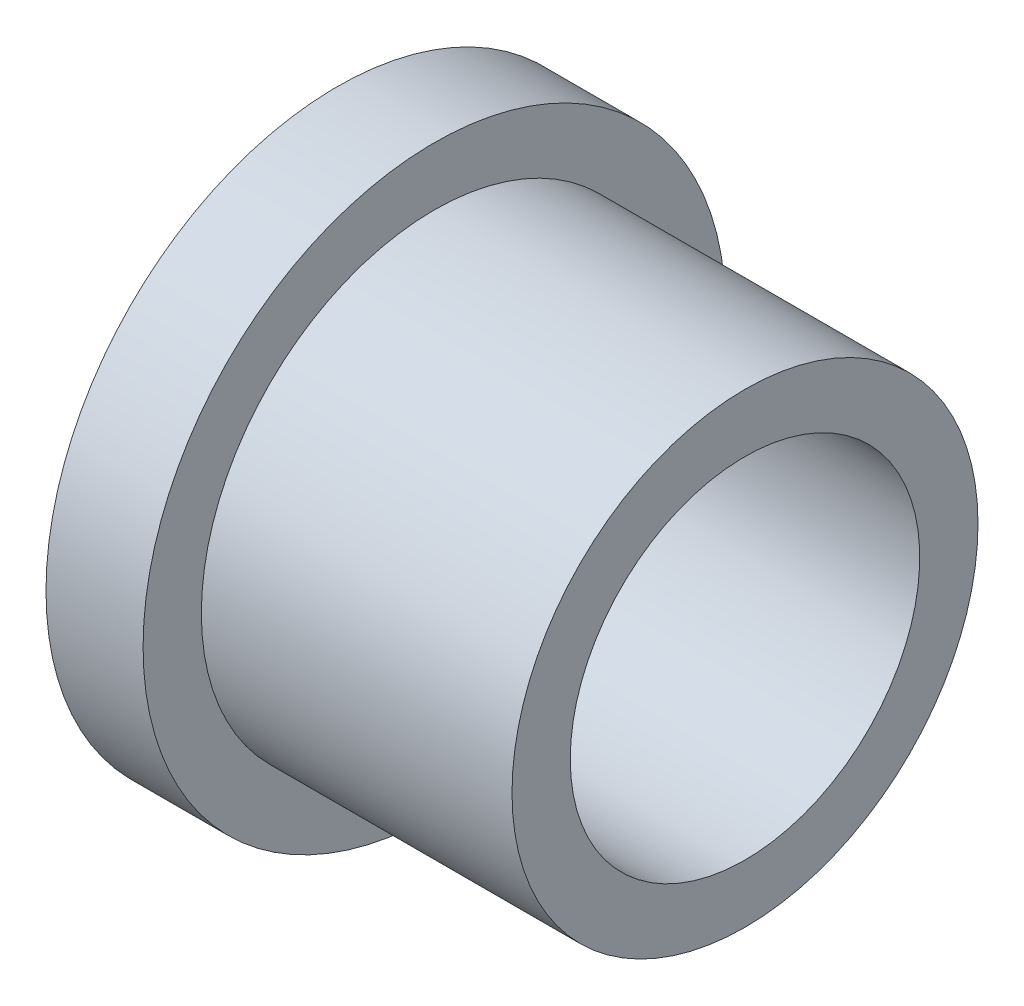
ISO-10303-21;
HEADER;
FILE_DESCRIPTION(('STEP AP214'),'2;1');
FILE_NAME('part.step','',(''),(''),'','','');
FILE_SCHEMA(('AUTOMOTIVE_DESIGN { 1 0 10303 214 1 1 1 1 }'));
ENDSEC;
DATA;
#1=APPLICATION_CONTEXT('core data for automotive mechanical design processes');
#2=APPLICATION_PROTOCOL_DEFINITION('international standard','automotive_design',2000,#1);
#3=PRODUCT_CONTEXT('',#1,'mechanical');
#4=PRODUCT('Part','Part','',(#3));
#5=PRODUCT_RELATED_PRODUCT_CATEGORY('part','',(#4));
#6=PRODUCT_DEFINITION_FORMATION('','',#4);
#7=PRODUCT_DEFINITION_CONTEXT('part definition',#1,'design');
#8=PRODUCT_DEFINITION('design','',#6,#7);
#9=PRODUCT_DEFINITION_SHAPE('','',#8);
#10=(LENGTH_UNIT() NAMED_UNIT(*) SI_UNIT(.MILLI.,.METRE.));
#11=(NAMED_UNIT(*) PLANE_ANGLE_UNIT() SI_UNIT($,.RADIAN.));
#12=(NAMED_UNIT(*) SI_UNIT($,.STERADIAN.) SOLID_ANGLE_UNIT());
#13=UNCERTAINTY_MEASURE_WITH_UNIT(LENGTH_MEASURE(1.E-05),#10,'distance_accuracy_value','');
#14=(GEOMETRIC_REPRESENTATION_CONTEXT(3) GLOBAL_UNCERTAINTY_ASSIGNED_CONTEXT((#13)) GLOBAL_UNIT_ASSIGNED_CONTEXT((#10,
#11,#12)) REPRESENTATION_CONTEXT('',''));
#15=CARTESIAN_POINT('',(0.,0.,0.));
#16=DIRECTION('',(0.,0.,1.));
#17=DIRECTION('',(1.,0.,0.));
#18=AXIS2_PLACEMENT_3D('',#15,#16,#17);
#19=CARTESIAN_POINT('',(0.,0.,0.));
#20=DIRECTION('',(-1.,0.,0.));
#21=DIRECTION('',(0.,0.,1.));
#22=AXIS2_PLACEMENT_3D('',#19,#20,#21);
#23=CYLINDRICAL_SURFACE('',#22,9.);
#24=CARTESIAN_POINT('',(21.,0.,0.));
#25=DIRECTION('',(-1.,0.,0.));
#26=DIRECTION('',(0.,0.,1.));
#27=AXIS2_PLACEMENT_3D('',#24,#25,#26);
#28=CIRCLE('',#27,9.);
#29=CARTESIAN_POINT('',(21.,0.,9.));
#30=VERTEX_POINT('',#29);
#31=EDGE_CURVE('E64',#30,#30,#28,.T.);
#32=ORIENTED_EDGE('',*,*,#31,.F.);
#33=EDGE_LOOP('',(#32));
#34=FACE_BOUND('',#33,.T.);
#35=CARTESIAN_POINT('',(0.,0.,0.));
#36=DIRECTION('',(-1.,0.,0.));
#37=DIRECTION('',(0.,0.,1.));
#38=AXIS2_PLACEMENT_3D('',#35,#36,#37);
#39=CIRCLE('',#38,9.);
#40=CARTESIAN_POINT('',(0.,0.,9.));
#41=VERTEX_POINT('',#40);
#42=EDGE_CURVE('E10',#41,#41,#39,.T.);
#43=ORIENTED_EDGE('',*,*,#42,.T.);
#44=EDGE_LOOP('',(#43));
#45=FACE_BOUND('',#44,.T.);
#46=ADVANCED_FACE('F37',(#34,#45),#23,.F.);
#47=CARTESIAN_POINT('',(0.,9.,0.));
#48=DIRECTION('',(1.,0.,0.));
#49=DIRECTION('',(0.,0.,-1.));
#50=AXIS2_PLACEMENT_3D('',#47,#48,#49);
#51=PLANE('',#50);
#52=ORIENTED_EDGE('',*,*,#42,.F.);
#53=EDGE_LOOP('',(#52));
#54=FACE_BOUND('',#53,.T.);
#55=CARTESIAN_POINT('',(0.,0.,0.));
#56=DIRECTION('',(-1.,0.,0.));
#57=DIRECTION('',(0.,0.,1.));
#58=AXIS2_PLACEMENT_3D('',#55,#56,#57);
#59=CIRCLE('',#58,15.);
#60=CARTESIAN_POINT('',(0.,0.,15.));
#61=VERTEX_POINT('',#60);
#62=EDGE_CURVE('E44',#61,#61,#59,.T.);
#63=ORIENTED_EDGE('',*,*,#62,.T.);
#64=EDGE_LOOP('',(#63));
#65=FACE_BOUND('',#64,.T.);
#66=ADVANCED_FACE('F72',(#54,#65),#51,.F.);
#67=CARTESIAN_POINT('',(0.,0.,0.));
#68=DIRECTION('',(-1.,0.,0.));
#69=DIRECTION('',(0.,0.,1.));
#70=AXIS2_PLACEMENT_3D('',#67,#68,#69);
#71=CYLINDRICAL_SURFACE('',#70,15.);
#72=ORIENTED_EDGE('',*,*,#62,.F.);
#73=EDGE_LOOP('',(#72));
#74=FACE_BOUND('',#73,.T.);
#75=CARTESIAN_POINT('',(5.,0.,0.));
#76=DIRECTION('',(-1.,0.,0.));
#77=DIRECTION('',(0.,0.,1.));
#78=AXIS2_PLACEMENT_3D('',#75,#76,#77);
#79=CIRCLE('',#78,15.);
#80=CARTESIAN_POINT('',(5.,0.,15.));
#81=VERTEX_POINT('',#80);
#82=EDGE_CURVE('E49',#81,#81,#79,.T.);
#83=ORIENTED_EDGE('',*,*,#82,.T.);
#84=EDGE_LOOP('',(#83));
#85=FACE_BOUND('',#84,.T.);
#86=ADVANCED_FACE('F76',(#74,#85),#71,.T.);
#87=CARTESIAN_POINT('',(5.,15.,0.));
#88=DIRECTION('',(-1.,0.,0.));
#89=DIRECTION('',(0.,0.,1.));
#90=AXIS2_PLACEMENT_3D('',#87,#88,#89);
#91=PLANE('',#90);
#92=ORIENTED_EDGE('',*,*,#82,.F.);
#93=EDGE_LOOP('',(#92));
#94=FACE_BOUND('',#93,.T.);
#95=CARTESIAN_POINT('',(5.,0.,0.));
#96=DIRECTION('',(-1.,0.,0.));
#97=DIRECTION('',(0.,0.,1.));
#98=AXIS2_PLACEMENT_3D('',#95,#96,#97);
#99=CIRCLE('',#98,12.);
#100=CARTESIAN_POINT('',(5.,0.,12.));
#101=VERTEX_POINT('',#100);
#102=EDGE_CURVE('E54',#101,#101,#99,.T.);
#103=ORIENTED_EDGE('',*,*,#102,.T.);
#104=EDGE_LOOP('',(#103));
#105=FACE_BOUND('',#104,.T.);
#106=ADVANCED_FACE('F81',(#94,#105),#91,.F.);
#107=CARTESIAN_POINT('',(0.,0.,0.));
#108=DIRECTION('',(-1.,0.,0.));
#109=DIRECTION('',(0.,0.,1.));
#110=AXIS2_PLACEMENT_3D('',#107,#108,#109);
#111=CYLINDRICAL_SURFACE('',#110,12.);
#112=ORIENTED_EDGE('',*,*,#102,.F.);
#113=EDGE_LOOP('',(#112));
#114=FACE_BOUND('',#113,.T.);
#115=CARTESIAN_POINT('',(21.,0.,0.));
#116=DIRECTION('',(-1.,0.,0.));
#117=DIRECTION('',(0.,0.,1.));
#118=AXIS2_PLACEMENT_3D('',#115,#116,#117);
#119=CIRCLE('',#118,12.);
#120=CARTESIAN_POINT('',(21.,0.,12.));
#121=VERTEX_POINT('',#120);
#122=EDGE_CURVE('E60',#121,#121,#119,.T.);
#123=ORIENTED_EDGE('',*,*,#122,.T.);
#124=EDGE_LOOP('',(#123));
#125=FACE_BOUND('',#124,.T.);
#126=ADVANCED_FACE('F87',(#114,#125),#111,.T.);
#127=CARTESIAN_POINT('',(21.,12.,0.));
#128=DIRECTION('',(-1.,0.,0.));
#129=DIRECTION('',(0.,0.,1.));
#130=AXIS2_PLACEMENT_3D('',#127,#128,#129);
#131=PLANE('',#130);
#132=ORIENTED_EDGE('',*,*,#122,.F.);
#133=EDGE_LOOP('',(#132));
#134=FACE_BOUND('',#133,.T.);
#135=ORIENTED_EDGE('',*,*,#31,.T.);
#136=EDGE_LOOP('',(#135));
#137=FACE_BOUND('',#136,.T.);
#138=ADVANCED_FACE('F69',(#134,#137),#131,.F.);
#139=CLOSED_SHELL('',(#46,#66,#86,#106,#126,#138));
#140=MANIFOLD_SOLID_BREP('B2',#139);
#141=ADVANCED_BREP_SHAPE_REPRESENTATION('',(#18,#140),#14);
#142=SHAPE_DEFINITION_REPRESENTATION(#9,#141);
ENDSEC;
END-ISO-10303-21;
